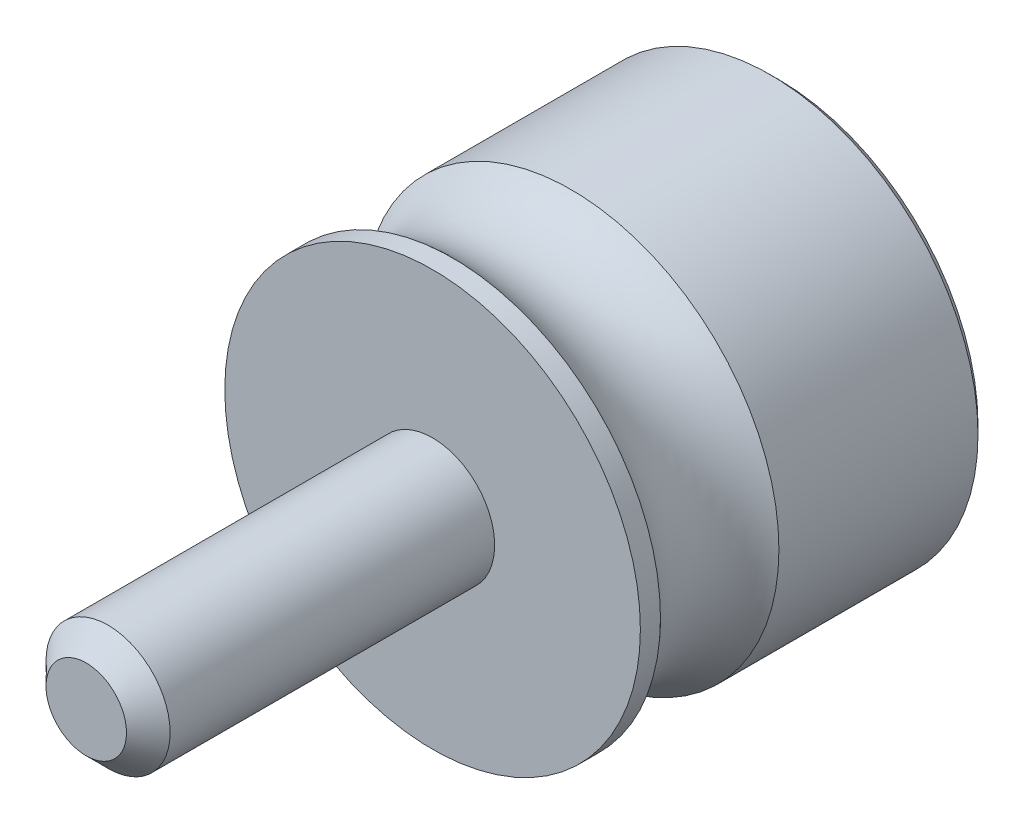
ISO-10303-21;
HEADER;
FILE_DESCRIPTION(('STEP AP214'),'2;1');
FILE_NAME('part.step','',(''),(''),'','','');
FILE_SCHEMA(('AUTOMOTIVE_DESIGN { 1 0 10303 214 1 1 1 1 }'));
ENDSEC;
DATA;
#1=APPLICATION_CONTEXT('core data for automotive mechanical design processes');
#2=APPLICATION_PROTOCOL_DEFINITION('international standard','automotive_design',2000,#1);
#3=PRODUCT_CONTEXT('',#1,'mechanical');
#4=PRODUCT('Part','Part','',(#3));
#5=PRODUCT_RELATED_PRODUCT_CATEGORY('part','',(#4));
#6=PRODUCT_DEFINITION_FORMATION('','',#4);
#7=PRODUCT_DEFINITION_CONTEXT('part definition',#1,'design');
#8=PRODUCT_DEFINITION('design','',#6,#7);
#9=PRODUCT_DEFINITION_SHAPE('','',#8);
#10=(LENGTH_UNIT() NAMED_UNIT(*) SI_UNIT(.MILLI.,.METRE.));
#11=(NAMED_UNIT(*) PLANE_ANGLE_UNIT() SI_UNIT($,.RADIAN.));
#12=(NAMED_UNIT(*) SI_UNIT($,.STERADIAN.) SOLID_ANGLE_UNIT());
#13=UNCERTAINTY_MEASURE_WITH_UNIT(LENGTH_MEASURE(1.E-05),#10,'distance_accuracy_value','');
#14=(GEOMETRIC_REPRESENTATION_CONTEXT(3) GLOBAL_UNCERTAINTY_ASSIGNED_CONTEXT((#13)) GLOBAL_UNIT_ASSIGNED_CONTEXT((#10,
#11,#12)) REPRESENTATION_CONTEXT('',''));
#15=CARTESIAN_POINT('',(0.,0.,0.));
#16=DIRECTION('',(0.,0.,1.));
#17=DIRECTION('',(1.,0.,0.));
#18=AXIS2_PLACEMENT_3D('',#15,#16,#17);
#19=CARTESIAN_POINT('',(0.,0.,4.7625));
#20=DIRECTION('',(0.,0.,-1.));
#21=DIRECTION('',(-1.,0.,0.));
#22=AXIS2_PLACEMENT_3D('',#19,#20,#21);
#23=CYLINDRICAL_SURFACE('',#22,4.7625);
#24=CARTESIAN_POINT('',(0.,0.,0.200000000000006));
#25=DIRECTION('',(0.,0.,1.));
#26=DIRECTION('',(1.,0.,0.));
#27=AXIS2_PLACEMENT_3D('',#24,#25,#26);
#28=CIRCLE('',#27,4.7625);
#29=CARTESIAN_POINT('',(-4.7625,0.,0.200000000000006));
#30=VERTEX_POINT('',#29);
#31=EDGE_CURVE('E46',#30,#30,#28,.T.);
#32=CARTESIAN_POINT('',(0.,0.,4.7625));
#33=DIRECTION('',(0.,0.,1.));
#34=DIRECTION('',(1.,0.,0.));
#35=AXIS2_PLACEMENT_3D('',#32,#33,#34);
#36=CIRCLE('',#35,4.7625);
#37=CARTESIAN_POINT('',(-4.7625,0.,4.7625));
#38=VERTEX_POINT('',#37);
#39=EDGE_CURVE('E54',#38,#38,#36,.T.);
#40=CARTESIAN_POINT('',(-4.7625,0.,0.200000000000006));
#41=CARTESIAN_POINT('',(-4.7625,0.,0.247526041666672));
#42=CARTESIAN_POINT('',(-4.7625,0.,0.295052083333339));
#43=CARTESIAN_POINT('',(-4.7625,0.,0.390104166666672));
#44=CARTESIAN_POINT('',(-4.7625,0.,0.437630208333339));
#45=CARTESIAN_POINT('',(-4.7625,0.,0.532682291666672));
#46=CARTESIAN_POINT('',(-4.7625,0.,0.580208333333339));
#47=CARTESIAN_POINT('',(-4.7625,0.,0.675260416666672));
#48=CARTESIAN_POINT('',(-4.7625,0.,0.722786458333339));
#49=CARTESIAN_POINT('',(-4.7625,0.,0.817838541666672));
#50=CARTESIAN_POINT('',(-4.7625,0.,0.865364583333338));
#51=CARTESIAN_POINT('',(-4.7625,0.,0.960416666666671));
#52=CARTESIAN_POINT('',(-4.7625,0.,1.00794270833334));
#53=CARTESIAN_POINT('',(-4.7625,0.,1.10299479166667));
#54=CARTESIAN_POINT('',(-4.7625,0.,1.15052083333334));
#55=CARTESIAN_POINT('',(-4.7625,0.,1.24557291666667));
#56=CARTESIAN_POINT('',(-4.7625,0.,1.29309895833334));
#57=CARTESIAN_POINT('',(-4.7625,0.,1.38815104166667));
#58=CARTESIAN_POINT('',(-4.7625,0.,1.43567708333334));
#59=CARTESIAN_POINT('',(-4.7625,0.,1.53072916666667));
#60=CARTESIAN_POINT('',(-4.7625,0.,1.57825520833334));
#61=CARTESIAN_POINT('',(-4.7625,0.,1.67330729166667));
#62=CARTESIAN_POINT('',(-4.7625,0.,1.72083333333334));
#63=CARTESIAN_POINT('',(-4.7625,0.,1.81588541666667));
#64=CARTESIAN_POINT('',(-4.7625,0.,1.86341145833334));
#65=CARTESIAN_POINT('',(-4.7625,0.,1.95846354166667));
#66=CARTESIAN_POINT('',(-4.7625,0.,2.00598958333334));
#67=CARTESIAN_POINT('',(-4.7625,0.,2.10104166666667));
#68=CARTESIAN_POINT('',(-4.7625,0.,2.14856770833334));
#69=CARTESIAN_POINT('',(-4.7625,0.,2.24361979166667));
#70=CARTESIAN_POINT('',(-4.7625,0.,2.29114583333334));
#71=CARTESIAN_POINT('',(-4.7625,0.,2.38619791666667));
#72=CARTESIAN_POINT('',(-4.7625,0.,2.43372395833334));
#73=CARTESIAN_POINT('',(-4.7625,0.,2.52877604166667));
#74=CARTESIAN_POINT('',(-4.7625,0.,2.57630208333334));
#75=CARTESIAN_POINT('',(-4.7625,0.,2.67135416666667));
#76=CARTESIAN_POINT('',(-4.7625,0.,2.71888020833334));
#77=CARTESIAN_POINT('',(-4.7625,0.,2.81393229166667));
#78=CARTESIAN_POINT('',(-4.7625,0.,2.86145833333334));
#79=CARTESIAN_POINT('',(-4.7625,0.,2.95651041666667));
#80=CARTESIAN_POINT('',(-4.7625,0.,3.00403645833334));
#81=CARTESIAN_POINT('',(-4.7625,0.,3.09908854166667));
#82=CARTESIAN_POINT('',(-4.7625,0.,3.14661458333334));
#83=CARTESIAN_POINT('',(-4.7625,0.,3.24166666666667));
#84=CARTESIAN_POINT('',(-4.7625,0.,3.28919270833334));
#85=CARTESIAN_POINT('',(-4.7625,0.,3.38424479166667));
#86=CARTESIAN_POINT('',(-4.7625,0.,3.43177083333334));
#87=CARTESIAN_POINT('',(-4.7625,0.,3.52682291666667));
#88=CARTESIAN_POINT('',(-4.7625,0.,3.57434895833333));
#89=CARTESIAN_POINT('',(-4.7625,0.,3.66940104166667));
#90=CARTESIAN_POINT('',(-4.7625,0.,3.71692708333333));
#91=CARTESIAN_POINT('',(-4.7625,0.,3.81197916666667));
#92=CARTESIAN_POINT('',(-4.7625,0.,3.85950520833333));
#93=CARTESIAN_POINT('',(-4.7625,0.,3.95455729166667));
#94=CARTESIAN_POINT('',(-4.7625,0.,4.00208333333333));
#95=CARTESIAN_POINT('',(-4.7625,0.,4.09713541666667));
#96=CARTESIAN_POINT('',(-4.7625,0.,4.14466145833333));
#97=CARTESIAN_POINT('',(-4.7625,0.,4.23971354166667));
#98=CARTESIAN_POINT('',(-4.7625,0.,4.28723958333333));
#99=CARTESIAN_POINT('',(-4.7625,0.,4.38229166666667));
#100=CARTESIAN_POINT('',(-4.7625,0.,4.42981770833333));
#101=CARTESIAN_POINT('',(-4.7625,0.,4.52486979166667));
#102=CARTESIAN_POINT('',(-4.7625,0.,4.57239583333333));
#103=CARTESIAN_POINT('',(-4.7625,0.,4.66744791666667));
#104=CARTESIAN_POINT('',(-4.7625,0.,4.71497395833333));
#105=CARTESIAN_POINT('',(-4.7625,0.,4.7625));
#106=B_SPLINE_CURVE_WITH_KNOTS('',3,(#40,#41,#42,#43,#44,#45,#46,#47,#48,#49,#50,#51,#52,#53,
#54,#55,#56,#57,#58,#59,#60,#61,#62,#63,#64,#65,#66,#67,#68,#69,#70,#71,#72,#73,#74,#75,#76,#77,
#78,#79,#80,#81,#82,#83,#84,#85,#86,#87,#88,#89,#90,#91,#92,#93,#94,#95,#96,#97,#98,#99,#100,
#101,#102,#103,#104,#105),.UNSPECIFIED.,.F.,.F.,(4,2,2,2,2,2,2,2,2,2,2,2,2,2,2,2,2,2,2,2,2,2,2,
2,2,2,2,2,2,2,2,2,4),(0.,0.142578125,0.28515625,0.427734375,0.5703125,0.712890624999999,
0.855468749999999,0.998046874999998,1.140625,1.283203125,1.42578125,1.568359375,1.7109375,
1.853515625,1.99609375,2.138671875,2.28125,2.423828125,2.56640625,2.708984375,2.8515625,
2.994140625,3.13671875,3.279296875,3.421875,3.564453125,3.70703125,3.849609375,3.99218749999999,
4.13476562499999,4.27734374999999,4.41992187499999,4.56249999999999),.UNSPECIFIED.);
#107=EDGE_CURVE('BSEAM31',#30,#38,#106,.T.);
#108=ORIENTED_EDGE('',*,*,#31,.T.);
#109=ORIENTED_EDGE('',*,*,#39,.F.);
#110=ORIENTED_EDGE('',*,*,#107,.T.);
#111=ORIENTED_EDGE('',*,*,#107,.F.);
#112=EDGE_LOOP('',(#108,#110,#109,#111));
#113=FACE_BOUND('',#112,.T.);
#114=ADVANCED_FACE('F31',(#113),#23,.T.);
#115=CARTESIAN_POINT('',(0.,0.,0.));
#116=DIRECTION('',(0.,0.,1.));
#117=DIRECTION('',(1.,0.,0.));
#118=AXIS2_PLACEMENT_3D('',#115,#116,#117);
#119=PLANE('',#118);
#120=CARTESIAN_POINT('',(0.,0.,0.));
#121=DIRECTION('',(0.,0.,1.));
#122=DIRECTION('',(1.,0.,0.));
#123=AXIS2_PLACEMENT_3D('',#120,#121,#122);
#124=CIRCLE('',#123,4.56249999999999);
#125=CARTESIAN_POINT('',(4.56249999999999,0.,0.));
#126=VERTEX_POINT('',#125);
#127=EDGE_CURVE('E42',#126,#126,#124,.F.);
#128=ORIENTED_EDGE('',*,*,#127,.T.);
#129=EDGE_LOOP('',(#128));
#130=FACE_BOUND('',#129,.T.);
#131=ADVANCED_FACE('F70',(#130),#119,.F.);
#132=CARTESIAN_POINT('',(0.,0.,6.11982533125422));
#133=DIRECTION('',(0.,0.,1.));
#134=DIRECTION('',(1.,0.,0.));
#135=AXIS2_PLACEMENT_3D('',#132,#133,#134);
#136=TOROIDAL_SURFACE('',#135,6.11982533125422,1.91954789201228);
#137=CARTESIAN_POINT('',(0.,0.,7.47715066250844));
#138=DIRECTION('',(0.,0.,1.));
#139=DIRECTION('',(1.,0.,0.));
#140=AXIS2_PLACEMENT_3D('',#137,#138,#139);
#141=CIRCLE('',#140,4.7625);
#142=CARTESIAN_POINT('',(4.7625,0.,7.47715066250844));
#143=VERTEX_POINT('',#142);
#144=EDGE_CURVE('E60',#143,#143,#141,.T.);
#145=ORIENTED_EDGE('',*,*,#144,.F.);
#146=EDGE_LOOP('',(#145));
#147=FACE_BOUND('',#146,.T.);
#148=ORIENTED_EDGE('',*,*,#39,.T.);
#149=EDGE_LOOP('',(#148));
#150=FACE_BOUND('',#149,.T.);
#151=ADVANCED_FACE('F66',(#147,#150),#136,.F.);
#152=CARTESIAN_POINT('',(-4.7625,0.,7.9375));
#153=DIRECTION('',(0.,0.,-1.));
#154=DIRECTION('',(-1.,0.,0.));
#155=AXIS2_PLACEMENT_3D('',#152,#153,#154);
#156=PLANE('',#155);
#157=CARTESIAN_POINT('',(0.,0.,7.9375));
#158=DIRECTION('',(0.,0.,-1.));
#159=DIRECTION('',(-1.,0.,0.));
#160=AXIS2_PLACEMENT_3D('',#157,#158,#159);
#161=CIRCLE('',#160,1.4224);
#162=CARTESIAN_POINT('',(-1.4224,0.,7.9375));
#163=VERTEX_POINT('',#162);
#164=EDGE_CURVE('E51',#163,#163,#161,.F.);
#165=ORIENTED_EDGE('',*,*,#164,.F.);
#166=EDGE_LOOP('',(#165));
#167=FACE_BOUND('',#166,.T.);
#168=CARTESIAN_POINT('',(0.,0.,7.9375));
#169=DIRECTION('',(0.,0.,1.));
#170=DIRECTION('',(1.,0.,0.));
#171=AXIS2_PLACEMENT_3D('',#168,#169,#170);
#172=CIRCLE('',#171,4.7625);
#173=CARTESIAN_POINT('',(4.7625,0.,7.93749999999999));
#174=VERTEX_POINT('',#173);
#175=EDGE_CURVE('E57',#174,#174,#172,.T.);
#176=ORIENTED_EDGE('',*,*,#175,.T.);
#177=EDGE_LOOP('',(#176));
#178=FACE_BOUND('',#177,.T.);
#179=ADVANCED_FACE('F69',(#167,#178),#156,.F.);
#180=CARTESIAN_POINT('',(0.,0.,7.9375));
#181=DIRECTION('',(0.,0.,1.));
#182=DIRECTION('',(1.,0.,0.));
#183=AXIS2_PLACEMENT_3D('',#180,#181,#182);
#184=CYLINDRICAL_SURFACE('',#183,4.7625);
#185=ORIENTED_EDGE('',*,*,#175,.F.);
#186=EDGE_LOOP('',(#185));
#187=FACE_BOUND('',#186,.T.);
#188=ORIENTED_EDGE('',*,*,#144,.T.);
#189=EDGE_LOOP('',(#188));
#190=FACE_BOUND('',#189,.T.);
#191=ADVANCED_FACE('F64',(#187,#190),#184,.T.);
#192=CARTESIAN_POINT('',(0.,0.,15.875));
#193=DIRECTION('',(0.,0.,-1.));
#194=DIRECTION('',(-1.,0.,0.));
#195=AXIS2_PLACEMENT_3D('',#192,#193,#194);
#196=CYLINDRICAL_SURFACE('',#195,1.4224);
#197=CARTESIAN_POINT('',(0.,0.,15.375));
#198=DIRECTION('',(0.,0.,1.));
#199=DIRECTION('',(1.,0.,0.));
#200=AXIS2_PLACEMENT_3D('',#197,#198,#199);
#201=CIRCLE('',#200,1.4224);
#202=CARTESIAN_POINT('',(1.4224,0.,15.375));
#203=VERTEX_POINT('',#202);
#204=EDGE_CURVE('E10',#203,#203,#201,.F.);
#205=ORIENTED_EDGE('',*,*,#204,.T.);
#206=EDGE_LOOP('',(#205));
#207=FACE_BOUND('',#206,.T.);
#208=ORIENTED_EDGE('',*,*,#164,.T.);
#209=EDGE_LOOP('',(#208));
#210=FACE_BOUND('',#209,.T.);
#211=ADVANCED_FACE('F91',(#207,#210),#196,.T.);
#212=CARTESIAN_POINT('',(0.,0.,15.875));
#213=DIRECTION('',(0.,0.,1.));
#214=DIRECTION('',(1.,0.,0.));
#215=AXIS2_PLACEMENT_3D('',#212,#213,#214);
#216=PLANE('',#215);
#217=CARTESIAN_POINT('',(0.,0.,15.875));
#218=DIRECTION('',(0.,0.,1.));
#219=DIRECTION('',(1.,0.,0.));
#220=AXIS2_PLACEMENT_3D('',#217,#218,#219);
#221=CIRCLE('',#220,0.922400000000001);
#222=CARTESIAN_POINT('',(0.922400000000001,0.,15.875));
#223=VERTEX_POINT('',#222);
#224=EDGE_CURVE('E38',#223,#223,#221,.T.);
#225=ORIENTED_EDGE('',*,*,#224,.T.);
#226=EDGE_LOOP('',(#225));
#227=FACE_BOUND('',#226,.T.);
#228=ADVANCED_FACE('F84',(#227),#216,.T.);
#229=CARTESIAN_POINT('',(0.,0.,0.200000000000006));
#230=DIRECTION('',(0.,0.,1.));
#231=DIRECTION('',(1.,0.,0.));
#232=AXIS2_PLACEMENT_3D('',#229,#230,#231);
#233=CONICAL_SURFACE('',#232,4.7625,0.785398163397448);
#234=ORIENTED_EDGE('',*,*,#127,.F.);
#235=EDGE_LOOP('',(#234));
#236=FACE_BOUND('',#235,.T.);
#237=ORIENTED_EDGE('',*,*,#31,.F.);
#238=EDGE_LOOP('',(#237));
#239=FACE_BOUND('',#238,.T.);
#240=ADVANCED_FACE('F82',(#236,#239),#233,.T.);
#241=CARTESIAN_POINT('',(0.,0.,15.875));
#242=DIRECTION('',(0.,0.,-1.));
#243=DIRECTION('',(-1.,0.,0.));
#244=AXIS2_PLACEMENT_3D('',#241,#242,#243);
#245=CONICAL_SURFACE('',#244,0.922400000000001,0.785398163397447);
#246=ORIENTED_EDGE('',*,*,#204,.F.);
#247=EDGE_LOOP('',(#246));
#248=FACE_BOUND('',#247,.T.);
#249=ORIENTED_EDGE('',*,*,#224,.F.);
#250=EDGE_LOOP('',(#249));
#251=FACE_BOUND('',#250,.T.);
#252=ADVANCED_FACE('F33',(#248,#251),#245,.T.);
#253=CLOSED_SHELL('',(#114,#131,#151,#179,#191,#211,#228,#240,#252));
#254=MANIFOLD_SOLID_BREP('B2',#253);
#255=ADVANCED_BREP_SHAPE_REPRESENTATION('',(#18,#254),#14);
#256=SHAPE_DEFINITION_REPRESENTATION(#9,#255);
ENDSEC;
END-ISO-10303-21;
